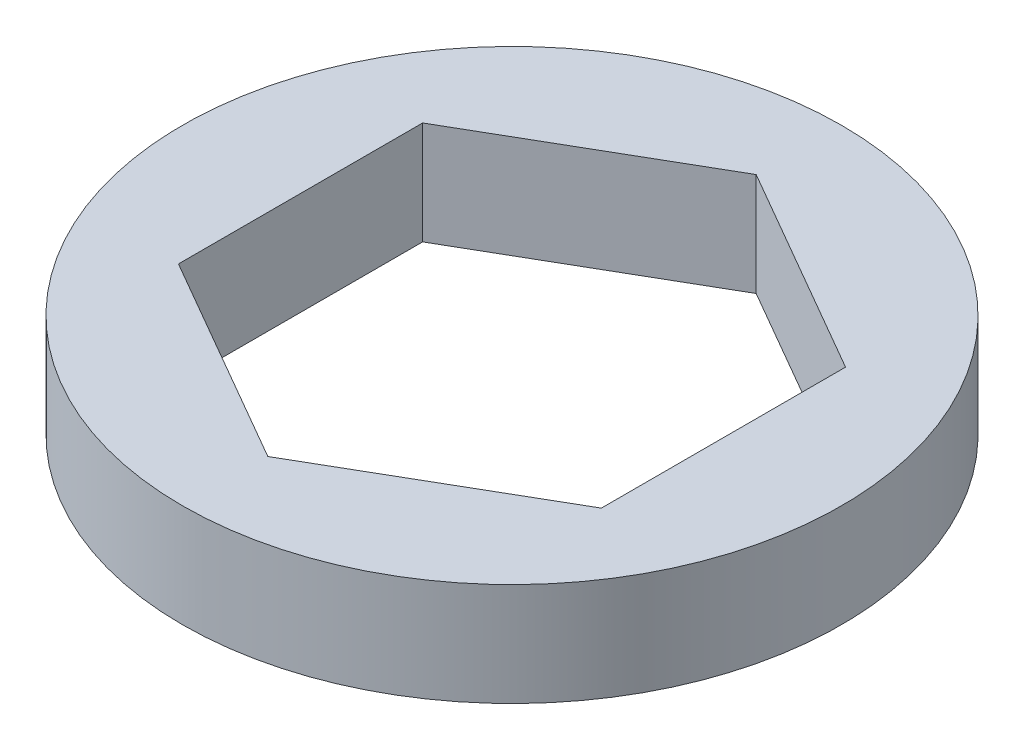
ISO-10303-21;
HEADER;
FILE_DESCRIPTION(('STEP AP214'),'2;1');
FILE_NAME('part.step','',(''),(''),'','','');
FILE_SCHEMA(('AUTOMOTIVE_DESIGN { 1 0 10303 214 1 1 1 1 }'));
ENDSEC;
DATA;
#1=APPLICATION_CONTEXT('core data for automotive mechanical design processes');
#2=APPLICATION_PROTOCOL_DEFINITION('international standard','automotive_design',2000,#1);
#3=PRODUCT_CONTEXT('',#1,'mechanical');
#4=PRODUCT('Part','Part','',(#3));
#5=PRODUCT_RELATED_PRODUCT_CATEGORY('part','',(#4));
#6=PRODUCT_DEFINITION_FORMATION('','',#4);
#7=PRODUCT_DEFINITION_CONTEXT('part definition',#1,'design');
#8=PRODUCT_DEFINITION('design','',#6,#7);
#9=PRODUCT_DEFINITION_SHAPE('','',#8);
#10=(LENGTH_UNIT() NAMED_UNIT(*) SI_UNIT(.MILLI.,.METRE.));
#11=(NAMED_UNIT(*) PLANE_ANGLE_UNIT() SI_UNIT($,.RADIAN.));
#12=(NAMED_UNIT(*) SI_UNIT($,.STERADIAN.) SOLID_ANGLE_UNIT());
#13=UNCERTAINTY_MEASURE_WITH_UNIT(LENGTH_MEASURE(1.E-05),#10,'distance_accuracy_value','');
#14=(GEOMETRIC_REPRESENTATION_CONTEXT(3) GLOBAL_UNCERTAINTY_ASSIGNED_CONTEXT((#13)) GLOBAL_UNIT_ASSIGNED_CONTEXT((#10,
#11,#12)) REPRESENTATION_CONTEXT('',''));
#15=CARTESIAN_POINT('',(0.,0.,0.));
#16=DIRECTION('',(0.,0.,1.));
#17=DIRECTION('',(1.,0.,0.));
#18=AXIS2_PLACEMENT_3D('',#15,#16,#17);
#19=CARTESIAN_POINT('',(0.,2.413,0.));
#20=DIRECTION('',(0.,1.,0.));
#21=DIRECTION('',(0.,0.,1.));
#22=AXIS2_PLACEMENT_3D('',#19,#20,#21);
#23=PLANE('',#22);
#24=CARTESIAN_POINT('',(0.,2.413,0.));
#25=DIRECTION('',(0.,1.,0.));
#26=DIRECTION('',(0.,0.,1.));
#27=AXIS2_PLACEMENT_3D('',#24,#25,#26);
#28=CIRCLE('',#27,7.71923176659244);
#29=CARTESIAN_POINT('',(0.,2.413,7.71923176659244));
#30=VERTEX_POINT('',#29);
#31=EDGE_CURVE('E11',#30,#30,#28,.T.);
#32=ORIENTED_EDGE('',*,*,#31,.T.);
#33=EDGE_LOOP('',(#32));
#34=FACE_BOUND('',#33,.T.);
#35=DIRECTION('',(-0.866025403784438,0.,0.500000000000001));
#36=VECTOR('',#35,1.);
#37=CARTESIAN_POINT('',(0.,2.413,-5.71923176659244));
#38=LINE('',#37,#36);
#39=CARTESIAN_POINT('',(0.,2.413,-5.71923176659244));
#40=VERTEX_POINT('',#39);
#41=CARTESIAN_POINT('',(-4.95300000000001,2.413,-2.85961588329621));
#42=VERTEX_POINT('',#41);
#43=EDGE_CURVE('E94',#40,#42,#38,.T.);
#44=ORIENTED_EDGE('',*,*,#43,.F.);
#45=DIRECTION('',(-0.866025403784442,0.,-0.499999999999995));
#46=VECTOR('',#45,1.);
#47=CARTESIAN_POINT('',(4.95299999999997,2.413,-2.85961588329628));
#48=LINE('',#47,#46);
#49=CARTESIAN_POINT('',(4.95299999999997,2.413,-2.85961588329628));
#50=VERTEX_POINT('',#49);
#51=EDGE_CURVE('E86',#50,#40,#48,.T.);
#52=ORIENTED_EDGE('',*,*,#51,.F.);
#53=DIRECTION('',(0.,0.,-1.));
#54=VECTOR('',#53,1.);
#55=CARTESIAN_POINT('',(4.95300000000003,2.413,2.85961588329617));
#56=LINE('',#55,#54);
#57=CARTESIAN_POINT('',(4.95300000000003,2.413,2.85961588329617));
#58=VERTEX_POINT('',#57);
#59=EDGE_CURVE('E114',#58,#50,#56,.T.);
#60=ORIENTED_EDGE('',*,*,#59,.F.);
#61=DIRECTION('',(0.866025403784435,0.,-0.500000000000007));
#62=VECTOR('',#61,1.);
#63=CARTESIAN_POINT('',(0.,2.413,5.71923176659244));
#64=LINE('',#63,#62);
#65=CARTESIAN_POINT('',(0.,2.413,5.71923176659244));
#66=VERTEX_POINT('',#65);
#67=EDGE_CURVE('E112',#66,#58,#64,.T.);
#68=ORIENTED_EDGE('',*,*,#67,.F.);
#69=DIRECTION('',(0.866025403784442,0.,0.499999999999995));
#70=VECTOR('',#69,1.);
#71=CARTESIAN_POINT('',(-4.95299999999999,2.413,2.85961588329624));
#72=LINE('',#71,#70);
#73=CARTESIAN_POINT('',(-4.95299999999999,2.413,2.85961588329624));
#74=VERTEX_POINT('',#73);
#75=EDGE_CURVE('E108',#74,#66,#72,.T.);
#76=ORIENTED_EDGE('',*,*,#75,.F.);
#77=DIRECTION('',(0.,0.,1.));
#78=VECTOR('',#77,1.);
#79=CARTESIAN_POINT('',(-4.95300000000001,2.413,-2.85961588329621));
#80=LINE('',#79,#78);
#81=EDGE_CURVE('E106',#42,#74,#80,.T.);
#82=ORIENTED_EDGE('',*,*,#81,.F.);
#83=EDGE_LOOP('',(#44,#52,#60,#68,#76,#82));
#84=FACE_BOUND('',#83,.T.);
#85=ADVANCED_FACE('F33',(#34,#84),#23,.T.);
#86=CARTESIAN_POINT('',(0.,0.,0.));
#87=DIRECTION('',(0.,1.,0.));
#88=DIRECTION('',(0.,0.,1.));
#89=AXIS2_PLACEMENT_3D('',#86,#87,#88);
#90=PLANE('',#89);
#91=CARTESIAN_POINT('',(0.,0.,0.));
#92=DIRECTION('',(0.,1.,0.));
#93=DIRECTION('',(0.,0.,1.));
#94=AXIS2_PLACEMENT_3D('',#91,#92,#93);
#95=CIRCLE('',#94,7.71923176659244);
#96=CARTESIAN_POINT('',(0.,0.,7.71923176659244));
#97=VERTEX_POINT('',#96);
#98=EDGE_CURVE('E37',#97,#97,#95,.T.);
#99=ORIENTED_EDGE('',*,*,#98,.F.);
#100=EDGE_LOOP('',(#99));
#101=FACE_BOUND('',#100,.T.);
#102=DIRECTION('',(-0.866025403784442,0.,-0.499999999999995));
#103=VECTOR('',#102,1.);
#104=CARTESIAN_POINT('',(4.95299999999997,0.,-2.85961588329628));
#105=LINE('',#104,#103);
#106=CARTESIAN_POINT('',(4.95299999999997,0.,-2.85961588329628));
#107=VERTEX_POINT('',#106);
#108=CARTESIAN_POINT('',(0.,0.,-5.71923176659244));
#109=VERTEX_POINT('',#108);
#110=EDGE_CURVE('E56',#107,#109,#105,.T.);
#111=ORIENTED_EDGE('',*,*,#110,.T.);
#112=DIRECTION('',(-0.866025403784438,0.,0.500000000000001));
#113=VECTOR('',#112,1.);
#114=CARTESIAN_POINT('',(0.,0.,-5.71923176659244));
#115=LINE('',#114,#113);
#116=CARTESIAN_POINT('',(-4.95300000000001,0.,-2.85961588329621));
#117=VERTEX_POINT('',#116);
#118=EDGE_CURVE('E101',#109,#117,#115,.T.);
#119=ORIENTED_EDGE('',*,*,#118,.T.);
#120=DIRECTION('',(0.,0.,1.));
#121=VECTOR('',#120,1.);
#122=CARTESIAN_POINT('',(-4.95300000000001,0.,-2.85961588329621));
#123=LINE('',#122,#121);
#124=CARTESIAN_POINT('',(-4.95299999999999,0.,2.85961588329624));
#125=VERTEX_POINT('',#124);
#126=EDGE_CURVE('E118',#117,#125,#123,.T.);
#127=ORIENTED_EDGE('',*,*,#126,.T.);
#128=DIRECTION('',(0.866025403784442,0.,0.499999999999995));
#129=VECTOR('',#128,1.);
#130=CARTESIAN_POINT('',(-4.95299999999999,0.,2.85961588329624));
#131=LINE('',#130,#129);
#132=CARTESIAN_POINT('',(0.,0.,5.71923176659244));
#133=VERTEX_POINT('',#132);
#134=EDGE_CURVE('E121',#125,#133,#131,.T.);
#135=ORIENTED_EDGE('',*,*,#134,.T.);
#136=DIRECTION('',(0.866025403784435,0.,-0.500000000000007));
#137=VECTOR('',#136,1.);
#138=CARTESIAN_POINT('',(0.,0.,5.71923176659244));
#139=LINE('',#138,#137);
#140=CARTESIAN_POINT('',(4.95300000000003,0.,2.85961588329617));
#141=VERTEX_POINT('',#140);
#142=EDGE_CURVE('E124',#133,#141,#139,.T.);
#143=ORIENTED_EDGE('',*,*,#142,.T.);
#144=DIRECTION('',(0.,0.,-1.));
#145=VECTOR('',#144,1.);
#146=CARTESIAN_POINT('',(4.95300000000003,0.,2.85961588329617));
#147=LINE('',#146,#145);
#148=EDGE_CURVE('E95',#141,#107,#147,.T.);
#149=ORIENTED_EDGE('',*,*,#148,.T.);
#150=EDGE_LOOP('',(#111,#119,#127,#135,#143,#149));
#151=FACE_BOUND('',#150,.T.);
#152=ADVANCED_FACE('F141',(#101,#151),#90,.F.);
#153=CARTESIAN_POINT('',(0.,2.413,0.));
#154=DIRECTION('',(0.,-1.,0.));
#155=DIRECTION('',(0.,0.,-1.));
#156=AXIS2_PLACEMENT_3D('',#153,#154,#155);
#157=CYLINDRICAL_SURFACE('',#156,7.71923176659244);
#158=ORIENTED_EDGE('',*,*,#31,.F.);
#159=EDGE_LOOP('',(#158));
#160=FACE_BOUND('',#159,.T.);
#161=ORIENTED_EDGE('',*,*,#98,.T.);
#162=EDGE_LOOP('',(#161));
#163=FACE_BOUND('',#162,.T.);
#164=ADVANCED_FACE('F35',(#160,#163),#157,.T.);
#165=CARTESIAN_POINT('',(4.95299999999997,2.413,-2.85961588329628));
#166=DIRECTION('',(-0.499999999999995,0.,0.866025403784442));
#167=DIRECTION('',(0.866025403784442,0.,0.499999999999995));
#168=AXIS2_PLACEMENT_3D('',#165,#166,#167);
#169=PLANE('',#168);
#170=ORIENTED_EDGE('',*,*,#110,.F.);
#171=DIRECTION('',(0.,-1.,0.));
#172=VECTOR('',#171,1.);
#173=CARTESIAN_POINT('',(4.95299999999997,2.413,-2.85961588329628));
#174=LINE('',#173,#172);
#175=EDGE_CURVE('E90',#50,#107,#174,.T.);
#176=ORIENTED_EDGE('',*,*,#175,.F.);
#177=ORIENTED_EDGE('',*,*,#51,.T.);
#178=DIRECTION('',(0.,-1.,0.));
#179=VECTOR('',#178,1.);
#180=CARTESIAN_POINT('',(0.,2.413,-5.71923176659244));
#181=LINE('',#180,#179);
#182=EDGE_CURVE('E89',#40,#109,#181,.T.);
#183=ORIENTED_EDGE('',*,*,#182,.T.);
#184=EDGE_LOOP('',(#170,#176,#177,#183));
#185=FACE_BOUND('',#184,.T.);
#186=ADVANCED_FACE('F88',(#185),#169,.T.);
#187=CARTESIAN_POINT('',(0.,2.413,-5.71923176659244));
#188=DIRECTION('',(0.500000000000001,0.,0.866025403784438));
#189=DIRECTION('',(0.866025403784438,0.,-0.500000000000001));
#190=AXIS2_PLACEMENT_3D('',#187,#188,#189);
#191=PLANE('',#190);
#192=ORIENTED_EDGE('',*,*,#118,.F.);
#193=ORIENTED_EDGE('',*,*,#182,.F.);
#194=ORIENTED_EDGE('',*,*,#43,.T.);
#195=DIRECTION('',(0.,-1.,0.));
#196=VECTOR('',#195,1.);
#197=CARTESIAN_POINT('',(-4.95300000000001,2.413,-2.85961588329621));
#198=LINE('',#197,#196);
#199=EDGE_CURVE('E102',#42,#117,#198,.T.);
#200=ORIENTED_EDGE('',*,*,#199,.T.);
#201=EDGE_LOOP('',(#192,#193,#194,#200));
#202=FACE_BOUND('',#201,.T.);
#203=ADVANCED_FACE('F98',(#202),#191,.T.);
#204=CARTESIAN_POINT('',(-4.95300000000001,2.413,-2.85961588329621));
#205=DIRECTION('',(1.,0.,0.));
#206=DIRECTION('',(0.,0.,-1.));
#207=AXIS2_PLACEMENT_3D('',#204,#205,#206);
#208=PLANE('',#207);
#209=ORIENTED_EDGE('',*,*,#126,.F.);
#210=ORIENTED_EDGE('',*,*,#199,.F.);
#211=ORIENTED_EDGE('',*,*,#81,.T.);
#212=DIRECTION('',(0.,-1.,0.));
#213=VECTOR('',#212,1.);
#214=CARTESIAN_POINT('',(-4.95299999999999,2.413,2.85961588329624));
#215=LINE('',#214,#213);
#216=EDGE_CURVE('E133',#74,#125,#215,.T.);
#217=ORIENTED_EDGE('',*,*,#216,.T.);
#218=EDGE_LOOP('',(#209,#210,#211,#217));
#219=FACE_BOUND('',#218,.T.);
#220=ADVANCED_FACE('F137',(#219),#208,.T.);
#221=CARTESIAN_POINT('',(-4.95299999999999,2.413,2.85961588329624));
#222=DIRECTION('',(0.499999999999995,0.,-0.866025403784441));
#223=DIRECTION('',(-0.866025403784442,0.,-0.499999999999995));
#224=AXIS2_PLACEMENT_3D('',#221,#222,#223);
#225=PLANE('',#224);
#226=ORIENTED_EDGE('',*,*,#134,.F.);
#227=ORIENTED_EDGE('',*,*,#216,.F.);
#228=ORIENTED_EDGE('',*,*,#75,.T.);
#229=DIRECTION('',(0.,-1.,0.));
#230=VECTOR('',#229,1.);
#231=CARTESIAN_POINT('',(0.,2.413,5.71923176659244));
#232=LINE('',#231,#230);
#233=EDGE_CURVE('E131',#66,#133,#232,.T.);
#234=ORIENTED_EDGE('',*,*,#233,.T.);
#235=EDGE_LOOP('',(#226,#227,#228,#234));
#236=FACE_BOUND('',#235,.T.);
#237=ADVANCED_FACE('F149',(#236),#225,.T.);
#238=CARTESIAN_POINT('',(0.,2.413,5.71923176659244));
#239=DIRECTION('',(-0.500000000000007,0.,-0.866025403784434));
#240=DIRECTION('',(-0.866025403784434,0.,0.500000000000007));
#241=AXIS2_PLACEMENT_3D('',#238,#239,#240);
#242=PLANE('',#241);
#243=ORIENTED_EDGE('',*,*,#142,.F.);
#244=ORIENTED_EDGE('',*,*,#233,.F.);
#245=ORIENTED_EDGE('',*,*,#67,.T.);
#246=DIRECTION('',(0.,-1.,0.));
#247=VECTOR('',#246,1.);
#248=CARTESIAN_POINT('',(4.95300000000003,2.413,2.85961588329617));
#249=LINE('',#248,#247);
#250=EDGE_CURVE('E48',#58,#141,#249,.T.);
#251=ORIENTED_EDGE('',*,*,#250,.T.);
#252=EDGE_LOOP('',(#243,#244,#245,#251));
#253=FACE_BOUND('',#252,.T.);
#254=ADVANCED_FACE('F147',(#253),#242,.T.);
#255=CARTESIAN_POINT('',(4.95300000000003,2.413,2.85961588329617));
#256=DIRECTION('',(-1.,0.,0.));
#257=DIRECTION('',(0.,0.,1.));
#258=AXIS2_PLACEMENT_3D('',#255,#256,#257);
#259=PLANE('',#258);
#260=ORIENTED_EDGE('',*,*,#148,.F.);
#261=ORIENTED_EDGE('',*,*,#250,.F.);
#262=ORIENTED_EDGE('',*,*,#59,.T.);
#263=ORIENTED_EDGE('',*,*,#175,.T.);
#264=EDGE_LOOP('',(#260,#261,#262,#263));
#265=FACE_BOUND('',#264,.T.);
#266=ADVANCED_FACE('F143',(#265),#259,.T.);
#267=CLOSED_SHELL('',(#85,#152,#164,#186,#203,#220,#237,#254,#266));
#268=MANIFOLD_SOLID_BREP('B2',#267);
#269=ADVANCED_BREP_SHAPE_REPRESENTATION('',(#18,#268),#14);
#270=SHAPE_DEFINITION_REPRESENTATION(#9,#269);
ENDSEC;
END-ISO-10303-21;
